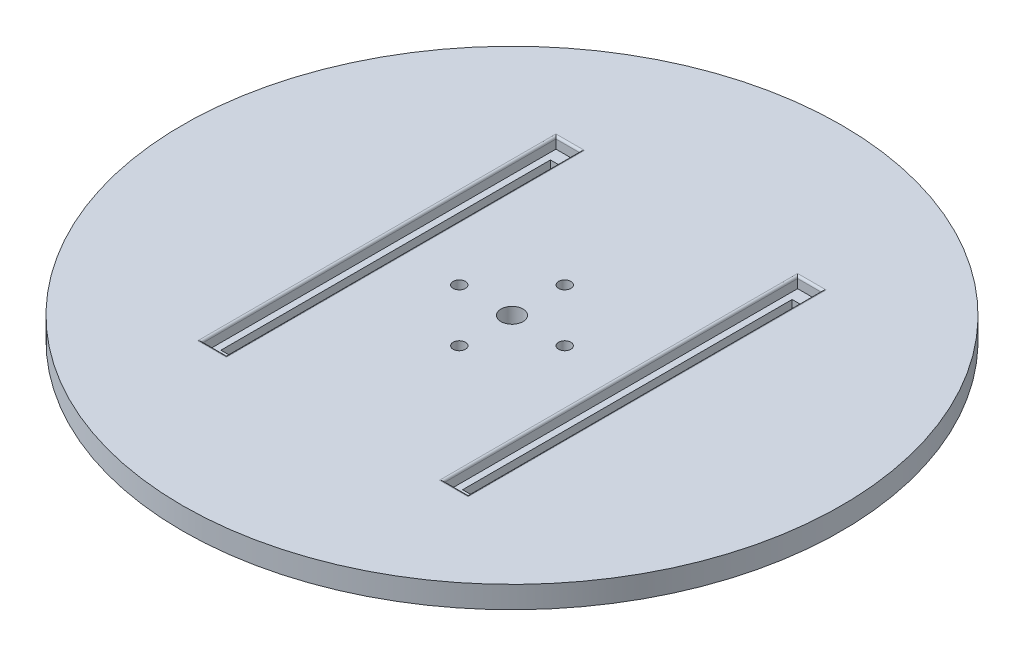
ISO-10303-21;
HEADER;
FILE_DESCRIPTION(('STEP AP214'),'2;1');
FILE_NAME('part.step','',(''),(''),'','','');
FILE_SCHEMA(('AUTOMOTIVE_DESIGN { 1 0 10303 214 1 1 1 1 }'));
ENDSEC;
DATA;
#1=APPLICATION_CONTEXT('core data for automotive mechanical design processes');
#2=APPLICATION_PROTOCOL_DEFINITION('international standard','automotive_design',2000,#1);
#3=PRODUCT_CONTEXT('',#1,'mechanical');
#4=PRODUCT('Part','Part','',(#3));
#5=PRODUCT_RELATED_PRODUCT_CATEGORY('part','',(#4));
#6=PRODUCT_DEFINITION_FORMATION('','',#4);
#7=PRODUCT_DEFINITION_CONTEXT('part definition',#1,'design');
#8=PRODUCT_DEFINITION('design','',#6,#7);
#9=PRODUCT_DEFINITION_SHAPE('','',#8);
#10=(LENGTH_UNIT() NAMED_UNIT(*) SI_UNIT(.MILLI.,.METRE.));
#11=(NAMED_UNIT(*) PLANE_ANGLE_UNIT() SI_UNIT($,.RADIAN.));
#12=(NAMED_UNIT(*) SI_UNIT($,.STERADIAN.) SOLID_ANGLE_UNIT());
#13=UNCERTAINTY_MEASURE_WITH_UNIT(LENGTH_MEASURE(1.E-05),#10,'distance_accuracy_value','');
#14=(GEOMETRIC_REPRESENTATION_CONTEXT(3) GLOBAL_UNCERTAINTY_ASSIGNED_CONTEXT((#13)) GLOBAL_UNIT_ASSIGNED_CONTEXT((#10,
#11,#12)) REPRESENTATION_CONTEXT('',''));
#15=CARTESIAN_POINT('',(0.,0.,0.));
#16=DIRECTION('',(0.,0.,1.));
#17=DIRECTION('',(1.,0.,0.));
#18=AXIS2_PLACEMENT_3D('',#15,#16,#17);
#19=CARTESIAN_POINT('',(0.,5.,0.));
#20=DIRECTION('',(0.,-1.,0.));
#21=DIRECTION('',(0.,0.,-1.));
#22=AXIS2_PLACEMENT_3D('',#19,#20,#21);
#23=CYLINDRICAL_SURFACE('',#22,75.);
#24=CARTESIAN_POINT('',(0.,5.,0.));
#25=DIRECTION('',(0.,1.,0.));
#26=DIRECTION('',(0.,0.,1.));
#27=AXIS2_PLACEMENT_3D('',#24,#25,#26);
#28=CIRCLE('',#27,75.);
#29=CARTESIAN_POINT('',(0.,5.,75.));
#30=VERTEX_POINT('',#29);
#31=EDGE_CURVE('E328',#30,#30,#28,.T.);
#32=ORIENTED_EDGE('',*,*,#31,.F.);
#33=EDGE_LOOP('',(#32));
#34=FACE_BOUND('',#33,.T.);
#35=CARTESIAN_POINT('',(0.,0.,0.));
#36=DIRECTION('',(0.,1.,0.));
#37=DIRECTION('',(0.,0.,1.));
#38=AXIS2_PLACEMENT_3D('',#35,#36,#37);
#39=CIRCLE('',#38,75.);
#40=CARTESIAN_POINT('',(0.,0.,75.));
#41=VERTEX_POINT('',#40);
#42=EDGE_CURVE('E326',#41,#41,#39,.T.);
#43=ORIENTED_EDGE('',*,*,#42,.T.);
#44=EDGE_LOOP('',(#43));
#45=FACE_BOUND('',#44,.T.);
#46=ADVANCED_FACE('F39',(#34,#45),#23,.T.);
#47=CARTESIAN_POINT('',(0.,5.,0.));
#48=DIRECTION('',(0.,1.,0.));
#49=DIRECTION('',(0.,0.,1.));
#50=AXIS2_PLACEMENT_3D('',#47,#48,#49);
#51=PLANE('',#50);
#52=DIRECTION('',(0.,0.,1.));
#53=VECTOR('',#52,1.);
#54=CARTESIAN_POINT('',(24.25,5.,-40.25));
#55=LINE('',#54,#53);
#56=CARTESIAN_POINT('',(24.25,5.,40.75));
#57=VERTEX_POINT('',#56);
#58=CARTESIAN_POINT('',(24.25,5.,-40.75));
#59=VERTEX_POINT('',#58);
#60=EDGE_CURVE('E361',#57,#59,#55,.F.);
#61=ORIENTED_EDGE('',*,*,#60,.T.);
#62=DIRECTION('',(-1.,0.,0.));
#63=VECTOR('',#62,1.);
#64=CARTESIAN_POINT('',(30.25,5.,-40.75));
#65=LINE('',#64,#63);
#66=CARTESIAN_POINT('',(30.75,5.,-40.75));
#67=VERTEX_POINT('',#66);
#68=EDGE_CURVE('E369',#59,#67,#65,.F.);
#69=ORIENTED_EDGE('',*,*,#68,.T.);
#70=DIRECTION('',(0.,0.,-1.));
#71=VECTOR('',#70,1.);
#72=CARTESIAN_POINT('',(30.75,5.,40.25));
#73=LINE('',#72,#71);
#74=CARTESIAN_POINT('',(30.75,5.,40.75));
#75=VERTEX_POINT('',#74);
#76=EDGE_CURVE('E370',#67,#75,#73,.F.);
#77=ORIENTED_EDGE('',*,*,#76,.T.);
#78=DIRECTION('',(1.,0.,0.));
#79=VECTOR('',#78,1.);
#80=CARTESIAN_POINT('',(24.75,5.,40.75));
#81=LINE('',#80,#79);
#82=EDGE_CURVE('E364',#75,#57,#81,.F.);
#83=ORIENTED_EDGE('',*,*,#82,.T.);
#84=EDGE_LOOP('',(#61,#69,#77,#83));
#85=FACE_BOUND('',#84,.T.);
#86=DIRECTION('',(0.,0.,-1.));
#87=VECTOR('',#86,1.);
#88=CARTESIAN_POINT('',(-24.25,5.,40.25));
#89=LINE('',#88,#87);
#90=CARTESIAN_POINT('',(-24.25,5.,-40.75));
#91=VERTEX_POINT('',#90);
#92=CARTESIAN_POINT('',(-24.25,5.,40.75));
#93=VERTEX_POINT('',#92);
#94=EDGE_CURVE('E340',#91,#93,#89,.F.);
#95=ORIENTED_EDGE('',*,*,#94,.T.);
#96=DIRECTION('',(1.,0.,0.));
#97=VECTOR('',#96,1.);
#98=CARTESIAN_POINT('',(-30.25,5.,40.75));
#99=LINE('',#98,#97);
#100=CARTESIAN_POINT('',(-30.75,5.,40.75));
#101=VERTEX_POINT('',#100);
#102=EDGE_CURVE('E341',#93,#101,#99,.F.);
#103=ORIENTED_EDGE('',*,*,#102,.T.);
#104=DIRECTION('',(0.,0.,1.));
#105=VECTOR('',#104,1.);
#106=CARTESIAN_POINT('',(-30.75,5.,-40.25));
#107=LINE('',#106,#105);
#108=CARTESIAN_POINT('',(-30.75,5.,-40.75));
#109=VERTEX_POINT('',#108);
#110=EDGE_CURVE('E343',#101,#109,#107,.F.);
#111=ORIENTED_EDGE('',*,*,#110,.T.);
#112=DIRECTION('',(-1.,0.,0.));
#113=VECTOR('',#112,1.);
#114=CARTESIAN_POINT('',(-24.75,5.,-40.75));
#115=LINE('',#114,#113);
#116=EDGE_CURVE('E338',#109,#91,#115,.F.);
#117=ORIENTED_EDGE('',*,*,#116,.T.);
#118=EDGE_LOOP('',(#95,#103,#111,#117));
#119=FACE_BOUND('',#118,.T.);
#120=CARTESIAN_POINT('',(-12.,5.,0.));
#121=DIRECTION('',(0.,1.,0.));
#122=DIRECTION('',(1.,0.,0.));
#123=AXIS2_PLACEMENT_3D('',#120,#121,#122);
#124=CIRCLE('',#123,1.4);
#125=CARTESIAN_POINT('',(-10.6,5.,0.));
#126=VERTEX_POINT('',#125);
#127=EDGE_CURVE('E301',#126,#126,#124,.T.);
#128=ORIENTED_EDGE('',*,*,#127,.F.);
#129=EDGE_LOOP('',(#128));
#130=FACE_BOUND('',#129,.T.);
#131=CARTESIAN_POINT('',(0.,5.,12.));
#132=DIRECTION('',(0.,1.,0.));
#133=DIRECTION('',(0.,0.,-1.));
#134=AXIS2_PLACEMENT_3D('',#131,#132,#133);
#135=CIRCLE('',#134,1.4);
#136=CARTESIAN_POINT('',(0.,5.,10.6));
#137=VERTEX_POINT('',#136);
#138=EDGE_CURVE('E310',#137,#137,#135,.T.);
#139=ORIENTED_EDGE('',*,*,#138,.F.);
#140=EDGE_LOOP('',(#139));
#141=FACE_BOUND('',#140,.T.);
#142=CARTESIAN_POINT('',(12.,5.,-1.25693328198353E-13));
#143=DIRECTION('',(0.,1.,0.));
#144=DIRECTION('',(-1.,0.,0.));
#145=AXIS2_PLACEMENT_3D('',#142,#143,#144);
#146=CIRCLE('',#145,1.4);
#147=CARTESIAN_POINT('',(10.6,5.,-1.11029106575212E-13));
#148=VERTEX_POINT('',#147);
#149=EDGE_CURVE('E289',#148,#148,#146,.T.);
#150=ORIENTED_EDGE('',*,*,#149,.F.);
#151=EDGE_LOOP('',(#150));
#152=FACE_BOUND('',#151,.T.);
#153=CARTESIAN_POINT('',(0.,5.,-12.));
#154=DIRECTION('',(0.,1.,0.));
#155=DIRECTION('',(0.,0.,1.));
#156=AXIS2_PLACEMENT_3D('',#153,#154,#155);
#157=CIRCLE('',#156,1.4);
#158=CARTESIAN_POINT('',(0.,5.,-10.6));
#159=VERTEX_POINT('',#158);
#160=EDGE_CURVE('E305',#159,#159,#157,.T.);
#161=ORIENTED_EDGE('',*,*,#160,.F.);
#162=EDGE_LOOP('',(#161));
#163=FACE_BOUND('',#162,.T.);
#164=CARTESIAN_POINT('',(0.,5.,0.));
#165=DIRECTION('',(0.,1.,0.));
#166=DIRECTION('',(0.,0.,1.));
#167=AXIS2_PLACEMENT_3D('',#164,#165,#166);
#168=CIRCLE('',#167,2.5);
#169=CARTESIAN_POINT('',(0.,5.,2.5));
#170=VERTEX_POINT('',#169);
#171=EDGE_CURVE('E319',#170,#170,#168,.T.);
#172=ORIENTED_EDGE('',*,*,#171,.F.);
#173=EDGE_LOOP('',(#172));
#174=FACE_BOUND('',#173,.T.);
#175=ORIENTED_EDGE('',*,*,#31,.T.);
#176=EDGE_LOOP('',(#175));
#177=FACE_BOUND('',#176,.T.);
#178=ADVANCED_FACE('F392',(#85,#119,#130,#141,#152,#163,#174,#177),#51,.T.);
#179=CARTESIAN_POINT('',(0.,0.,0.));
#180=DIRECTION('',(0.,1.,0.));
#181=DIRECTION('',(0.,0.,1.));
#182=AXIS2_PLACEMENT_3D('',#179,#180,#181);
#183=PLANE('',#182);
#184=DIRECTION('',(1.,0.,0.));
#185=VECTOR('',#184,1.);
#186=CARTESIAN_POINT('',(26.25,0.,37.5));
#187=LINE('',#186,#185);
#188=CARTESIAN_POINT('',(26.25,0.,37.5));
#189=VERTEX_POINT('',#188);
#190=CARTESIAN_POINT('',(28.75,0.,37.5));
#191=VERTEX_POINT('',#190);
#192=EDGE_CURVE('E187',#189,#191,#187,.T.);
#193=ORIENTED_EDGE('',*,*,#192,.T.);
#194=DIRECTION('',(0.,0.,-1.));
#195=VECTOR('',#194,1.);
#196=CARTESIAN_POINT('',(28.75,0.,37.5));
#197=LINE('',#196,#195);
#198=CARTESIAN_POINT('',(28.75,0.,-37.5));
#199=VERTEX_POINT('',#198);
#200=EDGE_CURVE('E179',#191,#199,#197,.T.);
#201=ORIENTED_EDGE('',*,*,#200,.T.);
#202=DIRECTION('',(-1.,0.,0.));
#203=VECTOR('',#202,1.);
#204=CARTESIAN_POINT('',(26.25,0.,-37.5));
#205=LINE('',#204,#203);
#206=CARTESIAN_POINT('',(26.25,0.,-37.5));
#207=VERTEX_POINT('',#206);
#208=EDGE_CURVE('E195',#199,#207,#205,.T.);
#209=ORIENTED_EDGE('',*,*,#208,.T.);
#210=DIRECTION('',(0.,0.,1.));
#211=VECTOR('',#210,1.);
#212=CARTESIAN_POINT('',(26.25,0.,37.5));
#213=LINE('',#212,#211);
#214=EDGE_CURVE('E198',#207,#189,#213,.T.);
#215=ORIENTED_EDGE('',*,*,#214,.T.);
#216=EDGE_LOOP('',(#193,#201,#209,#215));
#217=FACE_BOUND('',#216,.T.);
#218=DIRECTION('',(-1.,0.,0.));
#219=VECTOR('',#218,1.);
#220=CARTESIAN_POINT('',(-26.25,0.,-37.5));
#221=LINE('',#220,#219);
#222=CARTESIAN_POINT('',(-26.25,0.,-37.5));
#223=VERTEX_POINT('',#222);
#224=CARTESIAN_POINT('',(-28.75,0.,-37.5));
#225=VERTEX_POINT('',#224);
#226=EDGE_CURVE('E253',#223,#225,#221,.T.);
#227=ORIENTED_EDGE('',*,*,#226,.T.);
#228=DIRECTION('',(0.,0.,1.));
#229=VECTOR('',#228,1.);
#230=CARTESIAN_POINT('',(-28.75,0.,-37.5));
#231=LINE('',#230,#229);
#232=CARTESIAN_POINT('',(-28.75,0.,37.5));
#233=VERTEX_POINT('',#232);
#234=EDGE_CURVE('E241',#225,#233,#231,.T.);
#235=ORIENTED_EDGE('',*,*,#234,.T.);
#236=DIRECTION('',(1.,0.,0.));
#237=VECTOR('',#236,1.);
#238=CARTESIAN_POINT('',(-26.25,0.,37.5));
#239=LINE('',#238,#237);
#240=CARTESIAN_POINT('',(-26.25,0.,37.5));
#241=VERTEX_POINT('',#240);
#242=EDGE_CURVE('E243',#233,#241,#239,.T.);
#243=ORIENTED_EDGE('',*,*,#242,.T.);
#244=DIRECTION('',(0.,0.,-1.));
#245=VECTOR('',#244,1.);
#246=CARTESIAN_POINT('',(-26.25,0.,-37.5));
#247=LINE('',#246,#245);
#248=EDGE_CURVE('E246',#241,#223,#247,.T.);
#249=ORIENTED_EDGE('',*,*,#248,.T.);
#250=EDGE_LOOP('',(#227,#235,#243,#249));
#251=FACE_BOUND('',#250,.T.);
#252=CARTESIAN_POINT('',(-12.,0.,0.));
#253=DIRECTION('',(0.,1.,0.));
#254=DIRECTION('',(1.,0.,0.));
#255=AXIS2_PLACEMENT_3D('',#252,#253,#254);
#256=CIRCLE('',#255,1.4);
#257=CARTESIAN_POINT('',(-10.6,0.,0.));
#258=VERTEX_POINT('',#257);
#259=EDGE_CURVE('E298',#258,#258,#256,.T.);
#260=ORIENTED_EDGE('',*,*,#259,.T.);
#261=EDGE_LOOP('',(#260));
#262=FACE_BOUND('',#261,.T.);
#263=CARTESIAN_POINT('',(0.,0.,12.));
#264=DIRECTION('',(0.,1.,0.));
#265=DIRECTION('',(0.,0.,-1.));
#266=AXIS2_PLACEMENT_3D('',#263,#264,#265);
#267=CIRCLE('',#266,1.4);
#268=CARTESIAN_POINT('',(0.,0.,10.6));
#269=VERTEX_POINT('',#268);
#270=EDGE_CURVE('E308',#269,#269,#267,.T.);
#271=ORIENTED_EDGE('',*,*,#270,.T.);
#272=EDGE_LOOP('',(#271));
#273=FACE_BOUND('',#272,.T.);
#274=CARTESIAN_POINT('',(12.,0.,-1.25693328198353E-13));
#275=DIRECTION('',(0.,1.,0.));
#276=DIRECTION('',(-1.,0.,0.));
#277=AXIS2_PLACEMENT_3D('',#274,#275,#276);
#278=CIRCLE('',#277,1.4);
#279=CARTESIAN_POINT('',(10.6,0.,-1.11029106575212E-13));
#280=VERTEX_POINT('',#279);
#281=EDGE_CURVE('E315',#280,#280,#278,.T.);
#282=ORIENTED_EDGE('',*,*,#281,.T.);
#283=EDGE_LOOP('',(#282));
#284=FACE_BOUND('',#283,.T.);
#285=CARTESIAN_POINT('',(0.,0.,-12.));
#286=DIRECTION('',(0.,1.,0.));
#287=DIRECTION('',(0.,0.,1.));
#288=AXIS2_PLACEMENT_3D('',#285,#286,#287);
#289=CIRCLE('',#288,1.4);
#290=CARTESIAN_POINT('',(0.,0.,-10.6));
#291=VERTEX_POINT('',#290);
#292=EDGE_CURVE('E320',#291,#291,#289,.T.);
#293=ORIENTED_EDGE('',*,*,#292,.T.);
#294=EDGE_LOOP('',(#293));
#295=FACE_BOUND('',#294,.T.);
#296=CARTESIAN_POINT('',(0.,0.,0.));
#297=DIRECTION('',(0.,1.,0.));
#298=DIRECTION('',(0.,0.,1.));
#299=AXIS2_PLACEMENT_3D('',#296,#297,#298);
#300=CIRCLE('',#299,2.5);
#301=CARTESIAN_POINT('',(0.,0.,2.5));
#302=VERTEX_POINT('',#301);
#303=EDGE_CURVE('E323',#302,#302,#300,.T.);
#304=ORIENTED_EDGE('',*,*,#303,.T.);
#305=EDGE_LOOP('',(#304));
#306=FACE_BOUND('',#305,.T.);
#307=ORIENTED_EDGE('',*,*,#42,.F.);
#308=EDGE_LOOP('',(#307));
#309=FACE_BOUND('',#308,.T.);
#310=ADVANCED_FACE('F196',(#217,#251,#262,#273,#284,#295,#306,#309),#183,.F.);
#311=CARTESIAN_POINT('',(0.,0.,0.));
#312=DIRECTION('',(0.,1.,0.));
#313=DIRECTION('',(0.,0.,1.));
#314=AXIS2_PLACEMENT_3D('',#311,#312,#313);
#315=CYLINDRICAL_SURFACE('',#314,2.5);
#316=ORIENTED_EDGE('',*,*,#303,.F.);
#317=EDGE_LOOP('',(#316));
#318=FACE_BOUND('',#317,.T.);
#319=ORIENTED_EDGE('',*,*,#171,.T.);
#320=EDGE_LOOP('',(#319));
#321=FACE_BOUND('',#320,.T.);
#322=ADVANCED_FACE('F535',(#318,#321),#315,.F.);
#323=CARTESIAN_POINT('',(0.,0.,-12.));
#324=DIRECTION('',(0.,1.,0.));
#325=DIRECTION('',(0.,0.,1.));
#326=AXIS2_PLACEMENT_3D('',#323,#324,#325);
#327=CYLINDRICAL_SURFACE('',#326,1.4);
#328=ORIENTED_EDGE('',*,*,#292,.F.);
#329=EDGE_LOOP('',(#328));
#330=FACE_BOUND('',#329,.T.);
#331=ORIENTED_EDGE('',*,*,#160,.T.);
#332=EDGE_LOOP('',(#331));
#333=FACE_BOUND('',#332,.T.);
#334=ADVANCED_FACE('F526',(#330,#333),#327,.F.);
#335=CARTESIAN_POINT('',(12.,0.,-1.25693328198353E-13));
#336=DIRECTION('',(0.,1.,0.));
#337=DIRECTION('',(0.,0.,1.));
#338=AXIS2_PLACEMENT_3D('',#335,#336,#337);
#339=CYLINDRICAL_SURFACE('',#338,1.4);
#340=ORIENTED_EDGE('',*,*,#281,.F.);
#341=EDGE_LOOP('',(#340));
#342=FACE_BOUND('',#341,.T.);
#343=ORIENTED_EDGE('',*,*,#149,.T.);
#344=EDGE_LOOP('',(#343));
#345=FACE_BOUND('',#344,.T.);
#346=ADVANCED_FACE('F522',(#342,#345),#339,.F.);
#347=CARTESIAN_POINT('',(0.,0.,12.));
#348=DIRECTION('',(0.,1.,0.));
#349=DIRECTION('',(0.,0.,1.));
#350=AXIS2_PLACEMENT_3D('',#347,#348,#349);
#351=CYLINDRICAL_SURFACE('',#350,1.4);
#352=ORIENTED_EDGE('',*,*,#270,.F.);
#353=EDGE_LOOP('',(#352));
#354=FACE_BOUND('',#353,.T.);
#355=ORIENTED_EDGE('',*,*,#138,.T.);
#356=EDGE_LOOP('',(#355));
#357=FACE_BOUND('',#356,.T.);
#358=ADVANCED_FACE('F519',(#354,#357),#351,.F.);
#359=CARTESIAN_POINT('',(-12.,0.,0.));
#360=DIRECTION('',(0.,1.,0.));
#361=DIRECTION('',(0.,0.,1.));
#362=AXIS2_PLACEMENT_3D('',#359,#360,#361);
#363=CYLINDRICAL_SURFACE('',#362,1.4);
#364=ORIENTED_EDGE('',*,*,#259,.F.);
#365=EDGE_LOOP('',(#364));
#366=FACE_BOUND('',#365,.T.);
#367=ORIENTED_EDGE('',*,*,#127,.T.);
#368=EDGE_LOOP('',(#367));
#369=FACE_BOUND('',#368,.T.);
#370=ADVANCED_FACE('F516',(#366,#369),#363,.F.);
#371=CARTESIAN_POINT('',(-24.75,2.5,-40.25));
#372=DIRECTION('',(1.,0.,0.));
#373=DIRECTION('',(0.,0.,-1.));
#374=AXIS2_PLACEMENT_3D('',#371,#372,#373);
#375=PLANE('',#374);
#376=DIRECTION('',(0.,1.,0.));
#377=VECTOR('',#376,1.);
#378=CARTESIAN_POINT('',(-24.75,2.5,40.25));
#379=LINE('',#378,#377);
#380=CARTESIAN_POINT('',(-24.75,2.5,40.25));
#381=VERTEX_POINT('',#380);
#382=CARTESIAN_POINT('',(-24.75,4.5,40.25));
#383=VERTEX_POINT('',#382);
#384=EDGE_CURVE('E290',#381,#383,#379,.T.);
#385=ORIENTED_EDGE('',*,*,#384,.T.);
#386=DIRECTION('',(0.,0.,-1.));
#387=VECTOR('',#386,1.);
#388=CARTESIAN_POINT('',(-24.75,4.5,-40.25));
#389=LINE('',#388,#387);
#390=CARTESIAN_POINT('',(-24.75,4.5,-40.25));
#391=VERTEX_POINT('',#390);
#392=EDGE_CURVE('E348',#383,#391,#389,.T.);
#393=ORIENTED_EDGE('',*,*,#392,.T.);
#394=DIRECTION('',(0.,1.,0.));
#395=VECTOR('',#394,1.);
#396=CARTESIAN_POINT('',(-24.75,2.5,-40.25));
#397=LINE('',#396,#395);
#398=CARTESIAN_POINT('',(-24.75,2.5,-40.25));
#399=VERTEX_POINT('',#398);
#400=EDGE_CURVE('E288',#399,#391,#397,.T.);
#401=ORIENTED_EDGE('',*,*,#400,.F.);
#402=DIRECTION('',(0.,0.,-1.));
#403=VECTOR('',#402,1.);
#404=CARTESIAN_POINT('',(-24.75,2.5,-40.25));
#405=LINE('',#404,#403);
#406=EDGE_CURVE('E268',#381,#399,#405,.T.);
#407=ORIENTED_EDGE('',*,*,#406,.F.);
#408=EDGE_LOOP('',(#385,#393,#401,#407));
#409=FACE_BOUND('',#408,.T.);
#410=ADVANCED_FACE('F508',(#409),#375,.F.);
#411=CARTESIAN_POINT('',(-30.25,2.5,40.25));
#412=DIRECTION('',(0.,0.,1.));
#413=DIRECTION('',(1.,0.,0.));
#414=AXIS2_PLACEMENT_3D('',#411,#412,#413);
#415=PLANE('',#414);
#416=DIRECTION('',(0.,1.,0.));
#417=VECTOR('',#416,1.);
#418=CARTESIAN_POINT('',(-30.25,2.5,40.25));
#419=LINE('',#418,#417);
#420=CARTESIAN_POINT('',(-30.25,2.5,40.25));
#421=VERTEX_POINT('',#420);
#422=CARTESIAN_POINT('',(-30.25,4.5,40.25));
#423=VERTEX_POINT('',#422);
#424=EDGE_CURVE('E292',#421,#423,#419,.T.);
#425=ORIENTED_EDGE('',*,*,#424,.T.);
#426=DIRECTION('',(1.,0.,0.));
#427=VECTOR('',#426,1.);
#428=CARTESIAN_POINT('',(-24.75,4.5,40.25));
#429=LINE('',#428,#427);
#430=EDGE_CURVE('E335',#423,#383,#429,.T.);
#431=ORIENTED_EDGE('',*,*,#430,.T.);
#432=ORIENTED_EDGE('',*,*,#384,.F.);
#433=DIRECTION('',(1.,0.,0.));
#434=VECTOR('',#433,1.);
#435=CARTESIAN_POINT('',(-30.25,2.5,40.25));
#436=LINE('',#435,#434);
#437=EDGE_CURVE('E282',#421,#381,#436,.T.);
#438=ORIENTED_EDGE('',*,*,#437,.F.);
#439=EDGE_LOOP('',(#425,#431,#432,#438));
#440=FACE_BOUND('',#439,.T.);
#441=ADVANCED_FACE('F505',(#440),#415,.F.);
#442=CARTESIAN_POINT('',(-30.25,2.5,-40.25));
#443=DIRECTION('',(-1.,0.,0.));
#444=DIRECTION('',(0.,0.,1.));
#445=AXIS2_PLACEMENT_3D('',#442,#443,#444);
#446=PLANE('',#445);
#447=DIRECTION('',(0.,1.,0.));
#448=VECTOR('',#447,1.);
#449=CARTESIAN_POINT('',(-30.25,2.5,-40.25));
#450=LINE('',#449,#448);
#451=CARTESIAN_POINT('',(-30.25,2.5,-40.25));
#452=VERTEX_POINT('',#451);
#453=CARTESIAN_POINT('',(-30.25,4.5,-40.25));
#454=VERTEX_POINT('',#453);
#455=EDGE_CURVE('E294',#452,#454,#450,.T.);
#456=ORIENTED_EDGE('',*,*,#455,.T.);
#457=DIRECTION('',(0.,0.,1.));
#458=VECTOR('',#457,1.);
#459=CARTESIAN_POINT('',(-30.25,4.5,40.25));
#460=LINE('',#459,#458);
#461=EDGE_CURVE('E347',#454,#423,#460,.T.);
#462=ORIENTED_EDGE('',*,*,#461,.T.);
#463=ORIENTED_EDGE('',*,*,#424,.F.);
#464=DIRECTION('',(0.,0.,1.));
#465=VECTOR('',#464,1.);
#466=CARTESIAN_POINT('',(-30.25,2.5,-40.25));
#467=LINE('',#466,#465);
#468=EDGE_CURVE('E278',#452,#421,#467,.T.);
#469=ORIENTED_EDGE('',*,*,#468,.F.);
#470=EDGE_LOOP('',(#456,#462,#463,#469));
#471=FACE_BOUND('',#470,.T.);
#472=ADVANCED_FACE('F504',(#471),#446,.F.);
#473=CARTESIAN_POINT('',(-30.25,2.5,-40.25));
#474=DIRECTION('',(0.,0.,-1.));
#475=DIRECTION('',(-1.,0.,0.));
#476=AXIS2_PLACEMENT_3D('',#473,#474,#475);
#477=PLANE('',#476);
#478=ORIENTED_EDGE('',*,*,#400,.T.);
#479=DIRECTION('',(-1.,0.,0.));
#480=VECTOR('',#479,1.);
#481=CARTESIAN_POINT('',(-30.25,4.5,-40.25));
#482=LINE('',#481,#480);
#483=EDGE_CURVE('E346',#391,#454,#482,.T.);
#484=ORIENTED_EDGE('',*,*,#483,.T.);
#485=ORIENTED_EDGE('',*,*,#455,.F.);
#486=DIRECTION('',(-1.,0.,0.));
#487=VECTOR('',#486,1.);
#488=CARTESIAN_POINT('',(-30.25,2.5,-40.25));
#489=LINE('',#488,#487);
#490=EDGE_CURVE('E280',#399,#452,#489,.T.);
#491=ORIENTED_EDGE('',*,*,#490,.F.);
#492=EDGE_LOOP('',(#478,#484,#485,#491));
#493=FACE_BOUND('',#492,.T.);
#494=ADVANCED_FACE('F498',(#493),#477,.F.);
#495=CARTESIAN_POINT('',(0.,2.5,0.));
#496=DIRECTION('',(0.,1.,0.));
#497=DIRECTION('',(0.,0.,1.));
#498=AXIS2_PLACEMENT_3D('',#495,#496,#497);
#499=PLANE('',#498);
#500=DIRECTION('',(0.,0.,1.));
#501=VECTOR('',#500,1.);
#502=CARTESIAN_POINT('',(-28.75,2.5,-37.5));
#503=LINE('',#502,#501);
#504=CARTESIAN_POINT('',(-28.75,2.5,-37.5));
#505=VERTEX_POINT('',#504);
#506=CARTESIAN_POINT('',(-28.75,2.5,37.5));
#507=VERTEX_POINT('',#506);
#508=EDGE_CURVE('E254',#505,#507,#503,.T.);
#509=ORIENTED_EDGE('',*,*,#508,.F.);
#510=DIRECTION('',(-1.,0.,0.));
#511=VECTOR('',#510,1.);
#512=CARTESIAN_POINT('',(-26.25,2.5,-37.5));
#513=LINE('',#512,#511);
#514=CARTESIAN_POINT('',(-26.25,2.5,-37.5));
#515=VERTEX_POINT('',#514);
#516=EDGE_CURVE('E244',#515,#505,#513,.T.);
#517=ORIENTED_EDGE('',*,*,#516,.F.);
#518=DIRECTION('',(0.,0.,-1.));
#519=VECTOR('',#518,1.);
#520=CARTESIAN_POINT('',(-26.25,2.5,-37.5));
#521=LINE('',#520,#519);
#522=CARTESIAN_POINT('',(-26.25,2.5,37.5));
#523=VERTEX_POINT('',#522);
#524=EDGE_CURVE('E265',#523,#515,#521,.T.);
#525=ORIENTED_EDGE('',*,*,#524,.F.);
#526=DIRECTION('',(1.,0.,0.));
#527=VECTOR('',#526,1.);
#528=CARTESIAN_POINT('',(-26.25,2.5,37.5));
#529=LINE('',#528,#527);
#530=EDGE_CURVE('E256',#507,#523,#529,.T.);
#531=ORIENTED_EDGE('',*,*,#530,.F.);
#532=EDGE_LOOP('',(#509,#517,#525,#531));
#533=FACE_BOUND('',#532,.T.);
#534=ORIENTED_EDGE('',*,*,#406,.T.);
#535=ORIENTED_EDGE('',*,*,#490,.T.);
#536=ORIENTED_EDGE('',*,*,#468,.T.);
#537=ORIENTED_EDGE('',*,*,#437,.T.);
#538=EDGE_LOOP('',(#534,#535,#536,#537));
#539=FACE_BOUND('',#538,.T.);
#540=ADVANCED_FACE('F497',(#533,#539),#499,.T.);
#541=CARTESIAN_POINT('',(-28.75,0.,-37.5));
#542=DIRECTION('',(-1.,0.,0.));
#543=DIRECTION('',(0.,0.,1.));
#544=AXIS2_PLACEMENT_3D('',#541,#542,#543);
#545=PLANE('',#544);
#546=ORIENTED_EDGE('',*,*,#508,.T.);
#547=DIRECTION('',(0.,1.,0.));
#548=VECTOR('',#547,1.);
#549=CARTESIAN_POINT('',(-28.75,0.,37.5));
#550=LINE('',#549,#548);
#551=EDGE_CURVE('E255',#233,#507,#550,.T.);
#552=ORIENTED_EDGE('',*,*,#551,.F.);
#553=ORIENTED_EDGE('',*,*,#234,.F.);
#554=DIRECTION('',(0.,1.,0.));
#555=VECTOR('',#554,1.);
#556=CARTESIAN_POINT('',(-28.75,0.,-37.5));
#557=LINE('',#556,#555);
#558=EDGE_CURVE('E266',#225,#505,#557,.T.);
#559=ORIENTED_EDGE('',*,*,#558,.T.);
#560=EDGE_LOOP('',(#546,#552,#553,#559));
#561=FACE_BOUND('',#560,.T.);
#562=ADVANCED_FACE('F486',(#561),#545,.F.);
#563=CARTESIAN_POINT('',(-26.25,0.,-37.5));
#564=DIRECTION('',(0.,0.,-1.));
#565=DIRECTION('',(-1.,0.,0.));
#566=AXIS2_PLACEMENT_3D('',#563,#564,#565);
#567=PLANE('',#566);
#568=ORIENTED_EDGE('',*,*,#516,.T.);
#569=ORIENTED_EDGE('',*,*,#558,.F.);
#570=ORIENTED_EDGE('',*,*,#226,.F.);
#571=DIRECTION('',(0.,1.,0.));
#572=VECTOR('',#571,1.);
#573=CARTESIAN_POINT('',(-26.25,0.,-37.5));
#574=LINE('',#573,#572);
#575=EDGE_CURVE('E267',#223,#515,#574,.T.);
#576=ORIENTED_EDGE('',*,*,#575,.T.);
#577=EDGE_LOOP('',(#568,#569,#570,#576));
#578=FACE_BOUND('',#577,.T.);
#579=ADVANCED_FACE('F485',(#578),#567,.F.);
#580=CARTESIAN_POINT('',(-26.25,0.,-37.5));
#581=DIRECTION('',(1.,0.,0.));
#582=DIRECTION('',(0.,0.,-1.));
#583=AXIS2_PLACEMENT_3D('',#580,#581,#582);
#584=PLANE('',#583);
#585=ORIENTED_EDGE('',*,*,#524,.T.);
#586=ORIENTED_EDGE('',*,*,#575,.F.);
#587=ORIENTED_EDGE('',*,*,#248,.F.);
#588=DIRECTION('',(0.,1.,0.));
#589=VECTOR('',#588,1.);
#590=CARTESIAN_POINT('',(-26.25,0.,37.5));
#591=LINE('',#590,#589);
#592=EDGE_CURVE('E275',#241,#523,#591,.T.);
#593=ORIENTED_EDGE('',*,*,#592,.T.);
#594=EDGE_LOOP('',(#585,#586,#587,#593));
#595=FACE_BOUND('',#594,.T.);
#596=ADVANCED_FACE('F484',(#595),#584,.F.);
#597=CARTESIAN_POINT('',(-26.25,0.,37.5));
#598=DIRECTION('',(0.,0.,1.));
#599=DIRECTION('',(1.,0.,0.));
#600=AXIS2_PLACEMENT_3D('',#597,#598,#599);
#601=PLANE('',#600);
#602=ORIENTED_EDGE('',*,*,#530,.T.);
#603=ORIENTED_EDGE('',*,*,#592,.F.);
#604=ORIENTED_EDGE('',*,*,#242,.F.);
#605=ORIENTED_EDGE('',*,*,#551,.T.);
#606=EDGE_LOOP('',(#602,#603,#604,#605));
#607=FACE_BOUND('',#606,.T.);
#608=ADVANCED_FACE('F449',(#607),#601,.F.);
#609=CARTESIAN_POINT('',(-30.25,4.5,-40.75));
#610=DIRECTION('',(1.,0.,0.));
#611=DIRECTION('',(0.,0.,-1.));
#612=AXIS2_PLACEMENT_3D('',#609,#610,#611);
#613=CYLINDRICAL_SURFACE('',#612,0.5);
#614=CARTESIAN_POINT('',(-24.25,4.5,-40.75));
#615=DIRECTION('',(0.707106781186548,0.,0.707106781186547));
#616=DIRECTION('',(0.707106781186547,0.,-0.707106781186548));
#617=AXIS2_PLACEMENT_3D('',#614,#615,#616);
#618=ELLIPSE('',#617,0.707106781186547,0.5);
#619=EDGE_CURVE('E358',#91,#391,#618,.T.);
#620=ORIENTED_EDGE('',*,*,#619,.F.);
#621=ORIENTED_EDGE('',*,*,#116,.F.);
#622=CARTESIAN_POINT('',(-30.75,4.5,-40.75));
#623=DIRECTION('',(0.707106781186547,0.,-0.707106781186548));
#624=DIRECTION('',(-0.707106781186548,0.,-0.707106781186547));
#625=AXIS2_PLACEMENT_3D('',#622,#623,#624);
#626=ELLIPSE('',#625,0.707106781186548,0.5);
#627=EDGE_CURVE('E259',#454,#109,#626,.F.);
#628=ORIENTED_EDGE('',*,*,#627,.F.);
#629=ORIENTED_EDGE('',*,*,#483,.F.);
#630=EDGE_LOOP('',(#620,#621,#628,#629));
#631=FACE_BOUND('',#630,.T.);
#632=ADVANCED_FACE('F446',(#631),#613,.T.);
#633=CARTESIAN_POINT('',(-30.75,4.5,-40.25));
#634=DIRECTION('',(0.,0.,-1.));
#635=DIRECTION('',(-1.,0.,0.));
#636=AXIS2_PLACEMENT_3D('',#633,#634,#635);
#637=CYLINDRICAL_SURFACE('',#636,0.5);
#638=ORIENTED_EDGE('',*,*,#627,.T.);
#639=ORIENTED_EDGE('',*,*,#110,.F.);
#640=CARTESIAN_POINT('',(-30.75,4.5,40.75));
#641=DIRECTION('',(-0.707106781186548,0.,-0.707106781186547));
#642=DIRECTION('',(-0.707106781186547,0.,0.707106781186548));
#643=AXIS2_PLACEMENT_3D('',#640,#641,#642);
#644=ELLIPSE('',#643,0.707106781186547,0.5);
#645=EDGE_CURVE('E353',#423,#101,#644,.F.);
#646=ORIENTED_EDGE('',*,*,#645,.F.);
#647=ORIENTED_EDGE('',*,*,#461,.F.);
#648=EDGE_LOOP('',(#638,#639,#646,#647));
#649=FACE_BOUND('',#648,.T.);
#650=ADVANCED_FACE('F445',(#649),#637,.T.);
#651=CARTESIAN_POINT('',(-24.25,4.5,-40.25));
#652=DIRECTION('',(0.,0.,1.));
#653=DIRECTION('',(1.,0.,0.));
#654=AXIS2_PLACEMENT_3D('',#651,#652,#653);
#655=CYLINDRICAL_SURFACE('',#654,0.5);
#656=ORIENTED_EDGE('',*,*,#619,.T.);
#657=ORIENTED_EDGE('',*,*,#392,.F.);
#658=CARTESIAN_POINT('',(-24.25,4.5,40.75));
#659=DIRECTION('',(-0.707106781186547,0.,0.707106781186548));
#660=DIRECTION('',(-0.707106781186548,0.,-0.707106781186547));
#661=AXIS2_PLACEMENT_3D('',#658,#659,#660);
#662=ELLIPSE('',#661,0.707106781186548,0.5);
#663=EDGE_CURVE('E232',#93,#383,#662,.T.);
#664=ORIENTED_EDGE('',*,*,#663,.F.);
#665=ORIENTED_EDGE('',*,*,#94,.F.);
#666=EDGE_LOOP('',(#656,#657,#664,#665));
#667=FACE_BOUND('',#666,.T.);
#668=ADVANCED_FACE('F437',(#667),#655,.T.);
#669=CARTESIAN_POINT('',(-30.25,4.5,40.75));
#670=DIRECTION('',(-1.,0.,0.));
#671=DIRECTION('',(0.,0.,1.));
#672=AXIS2_PLACEMENT_3D('',#669,#670,#671);
#673=CYLINDRICAL_SURFACE('',#672,0.5);
#674=ORIENTED_EDGE('',*,*,#645,.T.);
#675=ORIENTED_EDGE('',*,*,#102,.F.);
#676=ORIENTED_EDGE('',*,*,#663,.T.);
#677=ORIENTED_EDGE('',*,*,#430,.F.);
#678=EDGE_LOOP('',(#674,#675,#676,#677));
#679=FACE_BOUND('',#678,.T.);
#680=ADVANCED_FACE('F434',(#679),#673,.T.);
#681=CARTESIAN_POINT('',(24.75,2.5,40.25));
#682=DIRECTION('',(-1.,0.,0.));
#683=DIRECTION('',(0.,0.,1.));
#684=AXIS2_PLACEMENT_3D('',#681,#682,#683);
#685=PLANE('',#684);
#686=DIRECTION('',(0.,1.,0.));
#687=VECTOR('',#686,1.);
#688=CARTESIAN_POINT('',(24.75,2.5,-40.25));
#689=LINE('',#688,#687);
#690=CARTESIAN_POINT('',(24.75,2.5,-40.25));
#691=VERTEX_POINT('',#690);
#692=CARTESIAN_POINT('',(24.75,4.5,-40.25));
#693=VERTEX_POINT('',#692);
#694=EDGE_CURVE('E235',#691,#693,#689,.T.);
#695=ORIENTED_EDGE('',*,*,#694,.T.);
#696=DIRECTION('',(0.,0.,1.));
#697=VECTOR('',#696,1.);
#698=CARTESIAN_POINT('',(24.75,4.5,40.25));
#699=LINE('',#698,#697);
#700=CARTESIAN_POINT('',(24.75,4.5,40.25));
#701=VERTEX_POINT('',#700);
#702=EDGE_CURVE('E11',#693,#701,#699,.T.);
#703=ORIENTED_EDGE('',*,*,#702,.T.);
#704=DIRECTION('',(0.,1.,0.));
#705=VECTOR('',#704,1.);
#706=CARTESIAN_POINT('',(24.75,2.5,40.25));
#707=LINE('',#706,#705);
#708=CARTESIAN_POINT('',(24.75,2.5,40.25));
#709=VERTEX_POINT('',#708);
#710=EDGE_CURVE('E233',#709,#701,#707,.T.);
#711=ORIENTED_EDGE('',*,*,#710,.F.);
#712=DIRECTION('',(0.,0.,1.));
#713=VECTOR('',#712,1.);
#714=CARTESIAN_POINT('',(24.75,2.5,40.25));
#715=LINE('',#714,#713);
#716=EDGE_CURVE('E214',#691,#709,#715,.T.);
#717=ORIENTED_EDGE('',*,*,#716,.F.);
#718=EDGE_LOOP('',(#695,#703,#711,#717));
#719=FACE_BOUND('',#718,.T.);
#720=ADVANCED_FACE('F403',(#719),#685,.F.);
#721=CARTESIAN_POINT('',(30.25,2.5,-40.25));
#722=DIRECTION('',(0.,0.,-1.));
#723=DIRECTION('',(-1.,0.,0.));
#724=AXIS2_PLACEMENT_3D('',#721,#722,#723);
#725=PLANE('',#724);
#726=DIRECTION('',(0.,1.,0.));
#727=VECTOR('',#726,1.);
#728=CARTESIAN_POINT('',(30.25,2.5,-40.25));
#729=LINE('',#728,#727);
#730=CARTESIAN_POINT('',(30.25,2.5,-40.25));
#731=VERTEX_POINT('',#730);
#732=CARTESIAN_POINT('',(30.25,4.5,-40.25));
#733=VERTEX_POINT('',#732);
#734=EDGE_CURVE('E234',#731,#733,#729,.T.);
#735=ORIENTED_EDGE('',*,*,#734,.T.);
#736=DIRECTION('',(-1.,0.,0.));
#737=VECTOR('',#736,1.);
#738=CARTESIAN_POINT('',(24.75,4.5,-40.25));
#739=LINE('',#738,#737);
#740=EDGE_CURVE('E355',#733,#693,#739,.T.);
#741=ORIENTED_EDGE('',*,*,#740,.T.);
#742=ORIENTED_EDGE('',*,*,#694,.F.);
#743=DIRECTION('',(-1.,0.,0.));
#744=VECTOR('',#743,1.);
#745=CARTESIAN_POINT('',(30.25,2.5,-40.25));
#746=LINE('',#745,#744);
#747=EDGE_CURVE('E227',#731,#691,#746,.T.);
#748=ORIENTED_EDGE('',*,*,#747,.F.);
#749=EDGE_LOOP('',(#735,#741,#742,#748));
#750=FACE_BOUND('',#749,.T.);
#751=ADVANCED_FACE('F405',(#750),#725,.F.);
#752=CARTESIAN_POINT('',(30.25,2.5,40.25));
#753=DIRECTION('',(1.,0.,0.));
#754=DIRECTION('',(0.,0.,-1.));
#755=AXIS2_PLACEMENT_3D('',#752,#753,#754);
#756=PLANE('',#755);
#757=DIRECTION('',(0.,1.,0.));
#758=VECTOR('',#757,1.);
#759=CARTESIAN_POINT('',(30.25,2.5,40.25));
#760=LINE('',#759,#758);
#761=CARTESIAN_POINT('',(30.25,2.5,40.25));
#762=VERTEX_POINT('',#761);
#763=CARTESIAN_POINT('',(30.25,4.5,40.25));
#764=VERTEX_POINT('',#763);
#765=EDGE_CURVE('E236',#762,#764,#760,.T.);
#766=ORIENTED_EDGE('',*,*,#765,.T.);
#767=DIRECTION('',(0.,0.,-1.));
#768=VECTOR('',#767,1.);
#769=CARTESIAN_POINT('',(30.25,4.5,-40.25));
#770=LINE('',#769,#768);
#771=EDGE_CURVE('E375',#764,#733,#770,.T.);
#772=ORIENTED_EDGE('',*,*,#771,.T.);
#773=ORIENTED_EDGE('',*,*,#734,.F.);
#774=DIRECTION('',(0.,0.,-1.));
#775=VECTOR('',#774,1.);
#776=CARTESIAN_POINT('',(30.25,2.5,40.25));
#777=LINE('',#776,#775);
#778=EDGE_CURVE('E223',#762,#731,#777,.T.);
#779=ORIENTED_EDGE('',*,*,#778,.F.);
#780=EDGE_LOOP('',(#766,#772,#773,#779));
#781=FACE_BOUND('',#780,.T.);
#782=ADVANCED_FACE('F413',(#781),#756,.F.);
#783=CARTESIAN_POINT('',(30.25,2.5,40.25));
#784=DIRECTION('',(0.,0.,1.));
#785=DIRECTION('',(1.,0.,0.));
#786=AXIS2_PLACEMENT_3D('',#783,#784,#785);
#787=PLANE('',#786);
#788=ORIENTED_EDGE('',*,*,#710,.T.);
#789=DIRECTION('',(1.,0.,0.));
#790=VECTOR('',#789,1.);
#791=CARTESIAN_POINT('',(30.25,4.5,40.25));
#792=LINE('',#791,#790);
#793=EDGE_CURVE('E48',#701,#764,#792,.T.);
#794=ORIENTED_EDGE('',*,*,#793,.T.);
#795=ORIENTED_EDGE('',*,*,#765,.F.);
#796=DIRECTION('',(1.,0.,0.));
#797=VECTOR('',#796,1.);
#798=CARTESIAN_POINT('',(30.25,2.5,40.25));
#799=LINE('',#798,#797);
#800=EDGE_CURVE('E225',#709,#762,#799,.T.);
#801=ORIENTED_EDGE('',*,*,#800,.F.);
#802=EDGE_LOOP('',(#788,#794,#795,#801));
#803=FACE_BOUND('',#802,.T.);
#804=ADVANCED_FACE('F415',(#803),#787,.F.);
#805=CARTESIAN_POINT('',(0.,2.5,0.));
#806=DIRECTION('',(0.,1.,0.));
#807=DIRECTION('',(0.,0.,-1.));
#808=AXIS2_PLACEMENT_3D('',#805,#806,#807);
#809=PLANE('',#808);
#810=DIRECTION('',(0.,0.,-1.));
#811=VECTOR('',#810,1.);
#812=CARTESIAN_POINT('',(28.75,2.5,37.5));
#813=LINE('',#812,#811);
#814=CARTESIAN_POINT('',(28.75,2.5,37.5));
#815=VERTEX_POINT('',#814);
#816=CARTESIAN_POINT('',(28.75,2.5,-37.5));
#817=VERTEX_POINT('',#816);
#818=EDGE_CURVE('E181',#815,#817,#813,.T.);
#819=ORIENTED_EDGE('',*,*,#818,.F.);
#820=DIRECTION('',(1.,0.,0.));
#821=VECTOR('',#820,1.);
#822=CARTESIAN_POINT('',(26.25,2.5,37.5));
#823=LINE('',#822,#821);
#824=CARTESIAN_POINT('',(26.25,2.5,37.5));
#825=VERTEX_POINT('',#824);
#826=EDGE_CURVE('E203',#825,#815,#823,.T.);
#827=ORIENTED_EDGE('',*,*,#826,.F.);
#828=DIRECTION('',(0.,0.,1.));
#829=VECTOR('',#828,1.);
#830=CARTESIAN_POINT('',(26.25,2.5,37.5));
#831=LINE('',#830,#829);
#832=CARTESIAN_POINT('',(26.25,2.5,-37.5));
#833=VERTEX_POINT('',#832);
#834=EDGE_CURVE('E204',#833,#825,#831,.T.);
#835=ORIENTED_EDGE('',*,*,#834,.F.);
#836=DIRECTION('',(-1.,0.,0.));
#837=VECTOR('',#836,1.);
#838=CARTESIAN_POINT('',(26.25,2.5,-37.5));
#839=LINE('',#838,#837);
#840=EDGE_CURVE('E209',#817,#833,#839,.T.);
#841=ORIENTED_EDGE('',*,*,#840,.F.);
#842=EDGE_LOOP('',(#819,#827,#835,#841));
#843=FACE_BOUND('',#842,.T.);
#844=ORIENTED_EDGE('',*,*,#716,.T.);
#845=ORIENTED_EDGE('',*,*,#800,.T.);
#846=ORIENTED_EDGE('',*,*,#778,.T.);
#847=ORIENTED_EDGE('',*,*,#747,.T.);
#848=EDGE_LOOP('',(#844,#845,#846,#847));
#849=FACE_BOUND('',#848,.T.);
#850=ADVANCED_FACE('F407',(#843,#849),#809,.T.);
#851=CARTESIAN_POINT('',(28.75,0.,37.5));
#852=DIRECTION('',(1.,0.,0.));
#853=DIRECTION('',(0.,0.,-1.));
#854=AXIS2_PLACEMENT_3D('',#851,#852,#853);
#855=PLANE('',#854);
#856=ORIENTED_EDGE('',*,*,#818,.T.);
#857=DIRECTION('',(0.,1.,0.));
#858=VECTOR('',#857,1.);
#859=CARTESIAN_POINT('',(28.75,0.,-37.5));
#860=LINE('',#859,#858);
#861=EDGE_CURVE('E178',#199,#817,#860,.T.);
#862=ORIENTED_EDGE('',*,*,#861,.F.);
#863=ORIENTED_EDGE('',*,*,#200,.F.);
#864=DIRECTION('',(0.,1.,0.));
#865=VECTOR('',#864,1.);
#866=CARTESIAN_POINT('',(28.75,0.,37.5));
#867=LINE('',#866,#865);
#868=EDGE_CURVE('E213',#191,#815,#867,.T.);
#869=ORIENTED_EDGE('',*,*,#868,.T.);
#870=EDGE_LOOP('',(#856,#862,#863,#869));
#871=FACE_BOUND('',#870,.T.);
#872=ADVANCED_FACE('F176',(#871),#855,.F.);
#873=CARTESIAN_POINT('',(26.25,0.,37.5));
#874=DIRECTION('',(0.,0.,1.));
#875=DIRECTION('',(1.,0.,0.));
#876=AXIS2_PLACEMENT_3D('',#873,#874,#875);
#877=PLANE('',#876);
#878=ORIENTED_EDGE('',*,*,#826,.T.);
#879=ORIENTED_EDGE('',*,*,#868,.F.);
#880=ORIENTED_EDGE('',*,*,#192,.F.);
#881=DIRECTION('',(0.,1.,0.));
#882=VECTOR('',#881,1.);
#883=CARTESIAN_POINT('',(26.25,0.,37.5));
#884=LINE('',#883,#882);
#885=EDGE_CURVE('E216',#189,#825,#884,.T.);
#886=ORIENTED_EDGE('',*,*,#885,.T.);
#887=EDGE_LOOP('',(#878,#879,#880,#886));
#888=FACE_BOUND('',#887,.T.);
#889=ADVANCED_FACE('F470',(#888),#877,.F.);
#890=CARTESIAN_POINT('',(26.25,0.,37.5));
#891=DIRECTION('',(-1.,0.,0.));
#892=DIRECTION('',(0.,0.,1.));
#893=AXIS2_PLACEMENT_3D('',#890,#891,#892);
#894=PLANE('',#893);
#895=ORIENTED_EDGE('',*,*,#834,.T.);
#896=ORIENTED_EDGE('',*,*,#885,.F.);
#897=ORIENTED_EDGE('',*,*,#214,.F.);
#898=DIRECTION('',(0.,1.,0.));
#899=VECTOR('',#898,1.);
#900=CARTESIAN_POINT('',(26.25,0.,-37.5));
#901=LINE('',#900,#899);
#902=EDGE_CURVE('E190',#207,#833,#901,.T.);
#903=ORIENTED_EDGE('',*,*,#902,.T.);
#904=EDGE_LOOP('',(#895,#896,#897,#903));
#905=FACE_BOUND('',#904,.T.);
#906=ADVANCED_FACE('F465',(#905),#894,.F.);
#907=CARTESIAN_POINT('',(26.25,0.,-37.5));
#908=DIRECTION('',(0.,0.,-1.));
#909=DIRECTION('',(-1.,0.,0.));
#910=AXIS2_PLACEMENT_3D('',#907,#908,#909);
#911=PLANE('',#910);
#912=ORIENTED_EDGE('',*,*,#840,.T.);
#913=ORIENTED_EDGE('',*,*,#902,.F.);
#914=ORIENTED_EDGE('',*,*,#208,.F.);
#915=ORIENTED_EDGE('',*,*,#861,.T.);
#916=EDGE_LOOP('',(#912,#913,#914,#915));
#917=FACE_BOUND('',#916,.T.);
#918=ADVANCED_FACE('F191',(#917),#911,.F.);
#919=CARTESIAN_POINT('',(30.25,4.5,40.75));
#920=DIRECTION('',(-1.,0.,0.));
#921=DIRECTION('',(0.,0.,1.));
#922=AXIS2_PLACEMENT_3D('',#919,#920,#921);
#923=CYLINDRICAL_SURFACE('',#922,0.5);
#924=CARTESIAN_POINT('',(24.25,4.5,40.75));
#925=DIRECTION('',(-0.707106781186548,0.,-0.707106781186547));
#926=DIRECTION('',(-0.707106781186547,0.,0.707106781186548));
#927=AXIS2_PLACEMENT_3D('',#924,#925,#926);
#928=ELLIPSE('',#927,0.707106781186547,0.5);
#929=EDGE_CURVE('E378',#57,#701,#928,.T.);
#930=ORIENTED_EDGE('',*,*,#929,.F.);
#931=ORIENTED_EDGE('',*,*,#82,.F.);
#932=CARTESIAN_POINT('',(30.75,4.5,40.75));
#933=DIRECTION('',(-0.707106781186547,0.,0.707106781186548));
#934=DIRECTION('',(0.707106781186548,0.,0.707106781186547));
#935=AXIS2_PLACEMENT_3D('',#932,#933,#934);
#936=ELLIPSE('',#935,0.707106781186548,0.5);
#937=EDGE_CURVE('E43',#764,#75,#936,.F.);
#938=ORIENTED_EDGE('',*,*,#937,.F.);
#939=ORIENTED_EDGE('',*,*,#793,.F.);
#940=EDGE_LOOP('',(#930,#931,#938,#939));
#941=FACE_BOUND('',#940,.T.);
#942=ADVANCED_FACE('F41',(#941),#923,.T.);
#943=CARTESIAN_POINT('',(30.75,4.5,40.25));
#944=DIRECTION('',(0.,0.,1.));
#945=DIRECTION('',(1.,0.,0.));
#946=AXIS2_PLACEMENT_3D('',#943,#944,#945);
#947=CYLINDRICAL_SURFACE('',#946,0.5);
#948=ORIENTED_EDGE('',*,*,#937,.T.);
#949=ORIENTED_EDGE('',*,*,#76,.F.);
#950=CARTESIAN_POINT('',(30.75,4.5,-40.75));
#951=DIRECTION('',(0.707106781186548,0.,0.707106781186547));
#952=DIRECTION('',(0.707106781186547,0.,-0.707106781186548));
#953=AXIS2_PLACEMENT_3D('',#950,#951,#952);
#954=ELLIPSE('',#953,0.707106781186547,0.5);
#955=EDGE_CURVE('E380',#733,#67,#954,.F.);
#956=ORIENTED_EDGE('',*,*,#955,.F.);
#957=ORIENTED_EDGE('',*,*,#771,.F.);
#958=EDGE_LOOP('',(#948,#949,#956,#957));
#959=FACE_BOUND('',#958,.T.);
#960=ADVANCED_FACE('F389',(#959),#947,.T.);
#961=CARTESIAN_POINT('',(24.25,4.5,40.25));
#962=DIRECTION('',(0.,0.,-1.));
#963=DIRECTION('',(-1.,0.,0.));
#964=AXIS2_PLACEMENT_3D('',#961,#962,#963);
#965=CYLINDRICAL_SURFACE('',#964,0.5);
#966=ORIENTED_EDGE('',*,*,#929,.T.);
#967=ORIENTED_EDGE('',*,*,#702,.F.);
#968=CARTESIAN_POINT('',(24.25,4.5,-40.75));
#969=DIRECTION('',(0.707106781186547,0.,-0.707106781186548));
#970=DIRECTION('',(0.707106781186548,0.,0.707106781186547));
#971=AXIS2_PLACEMENT_3D('',#968,#969,#970);
#972=ELLIPSE('',#971,0.707106781186548,0.5);
#973=EDGE_CURVE('E374',#59,#693,#972,.T.);
#974=ORIENTED_EDGE('',*,*,#973,.F.);
#975=ORIENTED_EDGE('',*,*,#60,.F.);
#976=EDGE_LOOP('',(#966,#967,#974,#975));
#977=FACE_BOUND('',#976,.T.);
#978=ADVANCED_FACE('F399',(#977),#965,.T.);
#979=CARTESIAN_POINT('',(30.25,4.5,-40.75));
#980=DIRECTION('',(1.,0.,0.));
#981=DIRECTION('',(0.,0.,-1.));
#982=AXIS2_PLACEMENT_3D('',#979,#980,#981);
#983=CYLINDRICAL_SURFACE('',#982,0.5);
#984=ORIENTED_EDGE('',*,*,#955,.T.);
#985=ORIENTED_EDGE('',*,*,#68,.F.);
#986=ORIENTED_EDGE('',*,*,#973,.T.);
#987=ORIENTED_EDGE('',*,*,#740,.F.);
#988=EDGE_LOOP('',(#984,#985,#986,#987));
#989=FACE_BOUND('',#988,.T.);
#990=ADVANCED_FACE('F396',(#989),#983,.T.);
#991=CLOSED_SHELL('',(#46,#178,#310,#322,#334,#346,#358,#370,#410,#441,#472,#494,#540,#562,#579,
#596,#608,#632,#650,#668,#680,#720,#751,#782,#804,#850,#872,#889,#906,#918,#942,#960,#978,#990));
#992=MANIFOLD_SOLID_BREP('B2',#991);
#993=ADVANCED_BREP_SHAPE_REPRESENTATION('',(#18,#992),#14);
#994=SHAPE_DEFINITION_REPRESENTATION(#9,#993);
ENDSEC;
END-ISO-10303-21;
